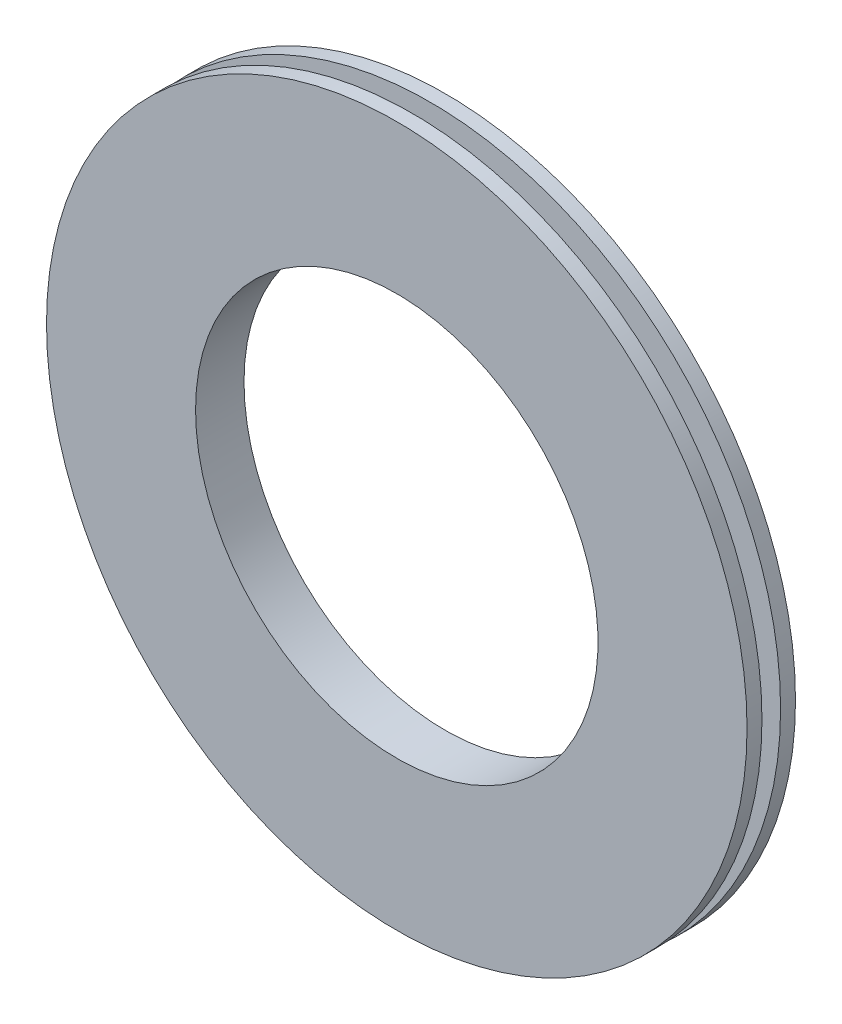
ISO-10303-21;
HEADER;
FILE_DESCRIPTION(('STEP AP214'),'2;1');
FILE_NAME('part.step','',(''),(''),'','','');
FILE_SCHEMA(('AUTOMOTIVE_DESIGN { 1 0 10303 214 1 1 1 1 }'));
ENDSEC;
DATA;
#1=APPLICATION_CONTEXT('core data for automotive mechanical design processes');
#2=APPLICATION_PROTOCOL_DEFINITION('international standard','automotive_design',2000,#1);
#3=PRODUCT_CONTEXT('',#1,'mechanical');
#4=PRODUCT('Part','Part','',(#3));
#5=PRODUCT_RELATED_PRODUCT_CATEGORY('part','',(#4));
#6=PRODUCT_DEFINITION_FORMATION('','',#4);
#7=PRODUCT_DEFINITION_CONTEXT('part definition',#1,'design');
#8=PRODUCT_DEFINITION('design','',#6,#7);
#9=PRODUCT_DEFINITION_SHAPE('','',#8);
#10=(LENGTH_UNIT() NAMED_UNIT(*) SI_UNIT(.MILLI.,.METRE.));
#11=(NAMED_UNIT(*) PLANE_ANGLE_UNIT() SI_UNIT($,.RADIAN.));
#12=(NAMED_UNIT(*) SI_UNIT($,.STERADIAN.) SOLID_ANGLE_UNIT());
#13=UNCERTAINTY_MEASURE_WITH_UNIT(LENGTH_MEASURE(1.E-05),#10,'distance_accuracy_value','');
#14=(GEOMETRIC_REPRESENTATION_CONTEXT(3) GLOBAL_UNCERTAINTY_ASSIGNED_CONTEXT((#13)) GLOBAL_UNIT_ASSIGNED_CONTEXT((#10,
#11,#12)) REPRESENTATION_CONTEXT('',''));
#15=CARTESIAN_POINT('',(0.,0.,0.));
#16=DIRECTION('',(0.,0.,1.));
#17=DIRECTION('',(1.,0.,0.));
#18=AXIS2_PLACEMENT_3D('',#15,#16,#17);
#19=CARTESIAN_POINT('',(0.,0.,9.75));
#20=DIRECTION('',(0.,0.,-1.));
#21=DIRECTION('',(-1.,0.,0.));
#22=AXIS2_PLACEMENT_3D('',#19,#20,#21);
#23=CYLINDRICAL_SURFACE('',#22,23.5);
#24=CARTESIAN_POINT('',(0.,0.,9.25));
#25=DIRECTION('',(0.,0.,-1.));
#26=DIRECTION('',(1.,0.,0.));
#27=AXIS2_PLACEMENT_3D('',#24,#25,#26);
#28=CIRCLE('',#27,23.5);
#29=CARTESIAN_POINT('',(-23.5,0.,9.25));
#30=VERTEX_POINT('',#29);
#31=EDGE_CURVE('P0_E80',#30,#30,#28,.T.);
#32=ORIENTED_EDGE('',*,*,#31,.F.);
#33=EDGE_LOOP('',(#32));
#34=FACE_BOUND('',#33,.T.);
#35=CARTESIAN_POINT('',(0.,0.,10.25));
#36=DIRECTION('',(0.,0.,-1.));
#37=DIRECTION('',(1.,0.,0.));
#38=AXIS2_PLACEMENT_3D('',#35,#36,#37);
#39=CIRCLE('',#38,23.5);
#40=CARTESIAN_POINT('',(-23.5,0.,10.25));
#41=VERTEX_POINT('',#40);
#42=EDGE_CURVE('P0_E11',#41,#41,#39,.T.);
#43=ORIENTED_EDGE('',*,*,#42,.T.);
#44=EDGE_LOOP('',(#43));
#45=FACE_BOUND('',#44,.T.);
#46=ADVANCED_FACE('P0_F17',(#34,#45),#23,.T.);
#47=CARTESIAN_POINT('',(-23.5,0.,10.25));
#48=DIRECTION('',(0.,0.,1.));
#49=DIRECTION('',(1.,0.,0.));
#50=AXIS2_PLACEMENT_3D('',#47,#48,#49);
#51=PLANE('',#50);
#52=CARTESIAN_POINT('',(0.,0.,10.25));
#53=DIRECTION('',(0.,0.,-1.));
#54=DIRECTION('',(1.,0.,0.));
#55=AXIS2_PLACEMENT_3D('',#52,#53,#54);
#56=CIRCLE('',#55,14.5);
#57=CARTESIAN_POINT('',(-14.5,0.,10.25));
#58=VERTEX_POINT('',#57);
#59=EDGE_CURVE('P0_E28',#58,#58,#56,.T.);
#60=ORIENTED_EDGE('',*,*,#59,.T.);
#61=EDGE_LOOP('',(#60));
#62=FACE_BOUND('',#61,.T.);
#63=ORIENTED_EDGE('',*,*,#42,.F.);
#64=EDGE_LOOP('',(#63));
#65=FACE_BOUND('',#64,.T.);
#66=ADVANCED_FACE('P0_F111',(#62,#65),#51,.T.);
#67=CARTESIAN_POINT('',(0.,0.,10.875));
#68=DIRECTION('',(0.,0.,-1.));
#69=DIRECTION('',(-1.,0.,0.));
#70=AXIS2_PLACEMENT_3D('',#67,#68,#69);
#71=CYLINDRICAL_SURFACE('',#70,14.5);
#72=ORIENTED_EDGE('',*,*,#59,.F.);
#73=EDGE_LOOP('',(#72));
#74=FACE_BOUND('',#73,.T.);
#75=CARTESIAN_POINT('',(0.,0.,11.5));
#76=DIRECTION('',(0.,0.,-1.));
#77=DIRECTION('',(1.,0.,0.));
#78=AXIS2_PLACEMENT_3D('',#75,#76,#77);
#79=CIRCLE('',#78,14.5);
#80=CARTESIAN_POINT('',(-14.5,0.,11.5));
#81=VERTEX_POINT('',#80);
#82=EDGE_CURVE('P0_E85',#81,#81,#79,.T.);
#83=ORIENTED_EDGE('',*,*,#82,.T.);
#84=EDGE_LOOP('',(#83));
#85=FACE_BOUND('',#84,.T.);
#86=ADVANCED_FACE('P0_F106',(#74,#85),#71,.T.);
#87=CARTESIAN_POINT('',(-14.5,0.,11.5));
#88=DIRECTION('',(0.,0.,-1.));
#89=DIRECTION('',(0.,-1.,0.));
#90=AXIS2_PLACEMENT_3D('',#87,#88,#89);
#91=PLANE('',#90);
#92=ORIENTED_EDGE('',*,*,#82,.F.);
#93=EDGE_LOOP('',(#92));
#94=FACE_BOUND('',#93,.T.);
#95=CARTESIAN_POINT('',(0.,0.,11.5));
#96=DIRECTION('',(0.,0.,-1.));
#97=DIRECTION('',(1.,0.,0.));
#98=AXIS2_PLACEMENT_3D('',#95,#96,#97);
#99=CIRCLE('',#98,23.5);
#100=CARTESIAN_POINT('',(-23.5,0.,11.5));
#101=VERTEX_POINT('',#100);
#102=EDGE_CURVE('P0_E21',#101,#101,#99,.T.);
#103=ORIENTED_EDGE('',*,*,#102,.T.);
#104=EDGE_LOOP('',(#103));
#105=FACE_BOUND('',#104,.T.);
#106=ADVANCED_FACE('P0_F96',(#94,#105),#91,.T.);
#107=CARTESIAN_POINT('',(0.,0.,12.));
#108=DIRECTION('',(0.,0.,-1.));
#109=DIRECTION('',(-1.,0.,0.));
#110=AXIS2_PLACEMENT_3D('',#107,#108,#109);
#111=CYLINDRICAL_SURFACE('',#110,23.5);
#112=ORIENTED_EDGE('',*,*,#102,.F.);
#113=EDGE_LOOP('',(#112));
#114=FACE_BOUND('',#113,.T.);
#115=CARTESIAN_POINT('',(0.,0.,12.5));
#116=DIRECTION('',(0.,0.,-1.));
#117=DIRECTION('',(1.,0.,0.));
#118=AXIS2_PLACEMENT_3D('',#115,#116,#117);
#119=CIRCLE('',#118,23.5);
#120=CARTESIAN_POINT('',(-23.5,0.,12.5));
#121=VERTEX_POINT('',#120);
#122=EDGE_CURVE('P0_E64',#121,#121,#119,.T.);
#123=ORIENTED_EDGE('',*,*,#122,.T.);
#124=EDGE_LOOP('',(#123));
#125=FACE_BOUND('',#124,.T.);
#126=ADVANCED_FACE('P0_F98',(#114,#125),#111,.T.);
#127=CARTESIAN_POINT('',(-23.5,0.,12.5));
#128=DIRECTION('',(0.,0.,1.));
#129=DIRECTION('',(1.,0.,0.));
#130=AXIS2_PLACEMENT_3D('',#127,#128,#129);
#131=PLANE('',#130);
#132=CARTESIAN_POINT('',(0.,0.,12.5));
#133=DIRECTION('',(0.,0.,-1.));
#134=DIRECTION('',(1.,0.,0.));
#135=AXIS2_PLACEMENT_3D('',#132,#133,#134);
#136=CIRCLE('',#135,13.5);
#137=CARTESIAN_POINT('',(-13.5,0.,12.5));
#138=VERTEX_POINT('',#137);
#139=EDGE_CURVE('P0_E70',#138,#138,#136,.T.);
#140=ORIENTED_EDGE('',*,*,#139,.T.);
#141=EDGE_LOOP('',(#140));
#142=FACE_BOUND('',#141,.T.);
#143=ORIENTED_EDGE('',*,*,#122,.F.);
#144=EDGE_LOOP('',(#143));
#145=FACE_BOUND('',#144,.T.);
#146=ADVANCED_FACE('P0_F19',(#142,#145),#131,.T.);
#147=CARTESIAN_POINT('',(0.,0.,10.875));
#148=DIRECTION('',(0.,0.,-1.));
#149=DIRECTION('',(-1.,0.,0.));
#150=AXIS2_PLACEMENT_3D('',#147,#148,#149);
#151=CYLINDRICAL_SURFACE('',#150,13.5);
#152=ORIENTED_EDGE('',*,*,#139,.F.);
#153=EDGE_LOOP('',(#152));
#154=FACE_BOUND('',#153,.T.);
#155=CARTESIAN_POINT('',(0.,0.,9.25));
#156=DIRECTION('',(0.,0.,-1.));
#157=DIRECTION('',(1.,0.,0.));
#158=AXIS2_PLACEMENT_3D('',#155,#156,#157);
#159=CIRCLE('',#158,13.5);
#160=CARTESIAN_POINT('',(-13.5,0.,9.25));
#161=VERTEX_POINT('',#160);
#162=EDGE_CURVE('P0_E74',#161,#161,#159,.T.);
#163=ORIENTED_EDGE('',*,*,#162,.T.);
#164=EDGE_LOOP('',(#163));
#165=FACE_BOUND('',#164,.T.);
#166=ADVANCED_FACE('P0_F105',(#154,#165),#151,.F.);
#167=CARTESIAN_POINT('',(-13.5,0.,9.25));
#168=DIRECTION('',(0.,0.,-1.));
#169=DIRECTION('',(0.,-1.,0.));
#170=AXIS2_PLACEMENT_3D('',#167,#168,#169);
#171=PLANE('',#170);
#172=ORIENTED_EDGE('',*,*,#162,.F.);
#173=EDGE_LOOP('',(#172));
#174=FACE_BOUND('',#173,.T.);
#175=ORIENTED_EDGE('',*,*,#31,.T.);
#176=EDGE_LOOP('',(#175));
#177=FACE_BOUND('',#176,.T.);
#178=ADVANCED_FACE('P0_F125',(#174,#177),#171,.T.);
#179=CLOSED_SHELL('',(#46,#66,#86,#106,#126,#146,#166,#178));
#180=MANIFOLD_SOLID_BREP('P0_B1',#179);
#181=CARTESIAN_POINT('',(0.,0.,10.875));
#182=DIRECTION('',(0.,0.,-1.));
#183=DIRECTION('',(-1.,0.,0.));
#184=AXIS2_PLACEMENT_3D('',#181,#182,#183);
#185=CYLINDRICAL_SURFACE('',#184,18.4095238095238);
#186=CARTESIAN_POINT('',(0.,0.,10.35));
#187=DIRECTION('',(0.,0.,-1.));
#188=DIRECTION('',(1.,0.,0.));
#189=AXIS2_PLACEMENT_3D('',#186,#187,#188);
#190=CIRCLE('',#189,18.4095238095238);
#191=CARTESIAN_POINT('',(-18.4095238095238,0.,10.35));
#192=VERTEX_POINT('',#191);
#193=EDGE_CURVE('P1_E53',#192,#192,#190,.T.);
#194=ORIENTED_EDGE('',*,*,#193,.F.);
#195=EDGE_LOOP('',(#194));
#196=FACE_BOUND('',#195,.T.);
#197=CARTESIAN_POINT('',(0.,0.,11.4));
#198=DIRECTION('',(0.,0.,-1.));
#199=DIRECTION('',(1.,0.,0.));
#200=AXIS2_PLACEMENT_3D('',#197,#198,#199);
#201=CIRCLE('',#200,18.4095238095238);
#202=CARTESIAN_POINT('',(-18.4095238095238,0.,11.4));
#203=VERTEX_POINT('',#202);
#204=EDGE_CURVE('P1_E11',#203,#203,#201,.T.);
#205=ORIENTED_EDGE('',*,*,#204,.T.);
#206=EDGE_LOOP('',(#205));
#207=FACE_BOUND('',#206,.T.);
#208=ADVANCED_FACE('P1_F17',(#196,#207),#185,.T.);
#209=CARTESIAN_POINT('',(-18.4095238095238,0.,11.4));
#210=DIRECTION('',(0.,0.,1.));
#211=DIRECTION('',(1.,0.,0.));
#212=AXIS2_PLACEMENT_3D('',#209,#210,#211);
#213=PLANE('',#212);
#214=CARTESIAN_POINT('',(0.,0.,11.4));
#215=DIRECTION('',(0.,0.,-1.));
#216=DIRECTION('',(1.,0.,0.));
#217=AXIS2_PLACEMENT_3D('',#214,#215,#216);
#218=CIRCLE('',#217,14.6);
#219=CARTESIAN_POINT('',(-14.6,0.,11.4));
#220=VERTEX_POINT('',#219);
#221=EDGE_CURVE('P1_E21',#220,#220,#218,.T.);
#222=ORIENTED_EDGE('',*,*,#221,.T.);
#223=EDGE_LOOP('',(#222));
#224=FACE_BOUND('',#223,.T.);
#225=ORIENTED_EDGE('',*,*,#204,.F.);
#226=EDGE_LOOP('',(#225));
#227=FACE_BOUND('',#226,.T.);
#228=ADVANCED_FACE('P1_F65',(#224,#227),#213,.T.);
#229=CARTESIAN_POINT('',(0.,0.,10.875));
#230=DIRECTION('',(0.,0.,-1.));
#231=DIRECTION('',(-1.,0.,0.));
#232=AXIS2_PLACEMENT_3D('',#229,#230,#231);
#233=CYLINDRICAL_SURFACE('',#232,14.6);
#234=ORIENTED_EDGE('',*,*,#221,.F.);
#235=EDGE_LOOP('',(#234));
#236=FACE_BOUND('',#235,.T.);
#237=CARTESIAN_POINT('',(0.,0.,10.35));
#238=DIRECTION('',(0.,0.,-1.));
#239=DIRECTION('',(1.,0.,0.));
#240=AXIS2_PLACEMENT_3D('',#237,#238,#239);
#241=CIRCLE('',#240,14.6);
#242=CARTESIAN_POINT('',(-14.6,0.,10.35));
#243=VERTEX_POINT('',#242);
#244=EDGE_CURVE('P1_E47',#243,#243,#241,.T.);
#245=ORIENTED_EDGE('',*,*,#244,.T.);
#246=EDGE_LOOP('',(#245));
#247=FACE_BOUND('',#246,.T.);
#248=ADVANCED_FACE('P1_F68',(#236,#247),#233,.F.);
#249=CARTESIAN_POINT('',(-14.6,0.,10.35));
#250=DIRECTION('',(0.,0.,-1.));
#251=DIRECTION('',(0.,-1.,0.));
#252=AXIS2_PLACEMENT_3D('',#249,#250,#251);
#253=PLANE('',#252);
#254=ORIENTED_EDGE('',*,*,#244,.F.);
#255=EDGE_LOOP('',(#254));
#256=FACE_BOUND('',#255,.T.);
#257=ORIENTED_EDGE('',*,*,#193,.T.);
#258=EDGE_LOOP('',(#257));
#259=FACE_BOUND('',#258,.T.);
#260=ADVANCED_FACE('P1_F19',(#256,#259),#253,.T.);
#261=CLOSED_SHELL('',(#208,#228,#248,#260));
#262=MANIFOLD_SOLID_BREP('P1_B1',#261);
#263=ADVANCED_BREP_SHAPE_REPRESENTATION('',(#18,#180,#262),#14);
#264=SHAPE_DEFINITION_REPRESENTATION(#9,#263);
ENDSEC;
END-ISO-10303-21;
